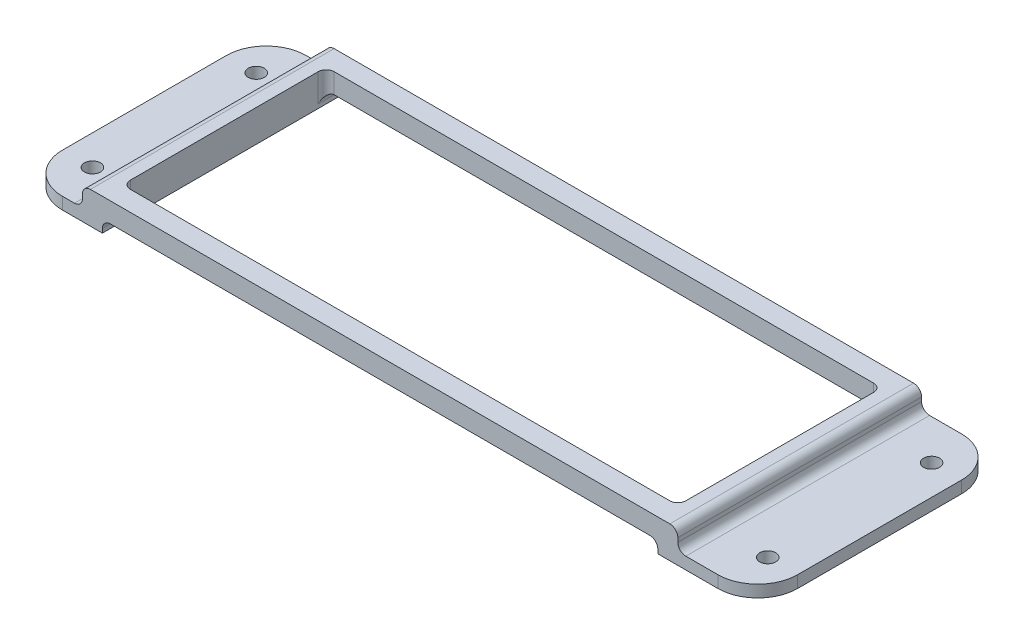
ISO-10303-21;
HEADER;
FILE_DESCRIPTION(('STEP AP214'),'2;1');
FILE_NAME('part.step','',(''),(''),'','','');
FILE_SCHEMA(('AUTOMOTIVE_DESIGN { 1 0 10303 214 1 1 1 1 }'));
ENDSEC;
DATA;
#1=APPLICATION_CONTEXT('core data for automotive mechanical design processes');
#2=APPLICATION_PROTOCOL_DEFINITION('international standard','automotive_design',2000,#1);
#3=PRODUCT_CONTEXT('',#1,'mechanical');
#4=PRODUCT('Part','Part','',(#3));
#5=PRODUCT_RELATED_PRODUCT_CATEGORY('part','',(#4));
#6=PRODUCT_DEFINITION_FORMATION('','',#4);
#7=PRODUCT_DEFINITION_CONTEXT('part definition',#1,'design');
#8=PRODUCT_DEFINITION('design','',#6,#7);
#9=PRODUCT_DEFINITION_SHAPE('','',#8);
#10=(LENGTH_UNIT() NAMED_UNIT(*) SI_UNIT(.MILLI.,.METRE.));
#11=(NAMED_UNIT(*) PLANE_ANGLE_UNIT() SI_UNIT($,.RADIAN.));
#12=(NAMED_UNIT(*) SI_UNIT($,.STERADIAN.) SOLID_ANGLE_UNIT());
#13=UNCERTAINTY_MEASURE_WITH_UNIT(LENGTH_MEASURE(1.E-05),#10,'distance_accuracy_value','');
#14=(GEOMETRIC_REPRESENTATION_CONTEXT(3) GLOBAL_UNCERTAINTY_ASSIGNED_CONTEXT((#13)) GLOBAL_UNIT_ASSIGNED_CONTEXT((#10,
#11,#12)) REPRESENTATION_CONTEXT('',''));
#15=CARTESIAN_POINT('',(0.,0.,0.));
#16=DIRECTION('',(0.,0.,1.));
#17=DIRECTION('',(1.,0.,0.));
#18=AXIS2_PLACEMENT_3D('',#15,#16,#17);
#19=CARTESIAN_POINT('',(20.,3.,-61.));
#20=DIRECTION('',(-1.,0.,0.));
#21=DIRECTION('',(0.,0.,1.));
#22=AXIS2_PLACEMENT_3D('',#19,#20,#21);
#23=PLANE('',#22);
#24=DIRECTION('',(0.,-1.,0.));
#25=VECTOR('',#24,1.);
#26=CARTESIAN_POINT('',(20.,3.,-61.));
#27=LINE('',#26,#25);
#28=CARTESIAN_POINT('',(20.,1.,-61.));
#29=VERTEX_POINT('',#28);
#30=CARTESIAN_POINT('',(20.,0.,-61.));
#31=VERTEX_POINT('',#30);
#32=EDGE_CURVE('E369',#29,#31,#27,.T.);
#33=ORIENTED_EDGE('',*,*,#32,.F.);
#34=DIRECTION('',(0.,0.,-1.));
#35=VECTOR('',#34,1.);
#36=CARTESIAN_POINT('',(20.,1.,-56.));
#37=LINE('',#36,#35);
#38=CARTESIAN_POINT('',(20.,1.,-54.));
#39=VERTEX_POINT('',#38);
#40=EDGE_CURVE('E491',#29,#39,#37,.F.);
#41=ORIENTED_EDGE('',*,*,#40,.T.);
#42=DIRECTION('',(0.,-1.,0.));
#43=VECTOR('',#42,1.);
#44=CARTESIAN_POINT('',(20.,8.,-54.));
#45=LINE('',#44,#43);
#46=CARTESIAN_POINT('',(20.,8.,-54.));
#47=VERTEX_POINT('',#46);
#48=EDGE_CURVE('E488',#39,#47,#45,.F.);
#49=ORIENTED_EDGE('',*,*,#48,.T.);
#50=DIRECTION('',(0.,0.,-1.));
#51=VECTOR('',#50,1.);
#52=CARTESIAN_POINT('',(20.,8.,-61.));
#53=LINE('',#52,#51);
#54=CARTESIAN_POINT('',(20.,8.,-7.00000000000001));
#55=VERTEX_POINT('',#54);
#56=EDGE_CURVE('E320',#55,#47,#53,.T.);
#57=ORIENTED_EDGE('',*,*,#56,.F.);
#58=DIRECTION('',(0.,1.,0.));
#59=VECTOR('',#58,1.);
#60=CARTESIAN_POINT('',(20.,3.,-7.));
#61=LINE('',#60,#59);
#62=CARTESIAN_POINT('',(20.,1.,-7.));
#63=VERTEX_POINT('',#62);
#64=EDGE_CURVE('E485',#55,#63,#61,.F.);
#65=ORIENTED_EDGE('',*,*,#64,.T.);
#66=DIRECTION('',(0.,0.,-1.));
#67=VECTOR('',#66,1.);
#68=CARTESIAN_POINT('',(20.,1.,0.));
#69=LINE('',#68,#67);
#70=CARTESIAN_POINT('',(20.,1.,0.));
#71=VERTEX_POINT('',#70);
#72=EDGE_CURVE('E482',#63,#71,#69,.F.);
#73=ORIENTED_EDGE('',*,*,#72,.T.);
#74=DIRECTION('',(0.,-1.,0.));
#75=VECTOR('',#74,1.);
#76=CARTESIAN_POINT('',(20.,3.,0.));
#77=LINE('',#76,#75);
#78=CARTESIAN_POINT('',(20.,0.,0.));
#79=VERTEX_POINT('',#78);
#80=EDGE_CURVE('E386',#71,#79,#77,.T.);
#81=ORIENTED_EDGE('',*,*,#80,.T.);
#82=DIRECTION('',(0.,0.,-1.));
#83=VECTOR('',#82,1.);
#84=CARTESIAN_POINT('',(20.,0.,-61.));
#85=LINE('',#84,#83);
#86=EDGE_CURVE('E373',#79,#31,#85,.T.);
#87=ORIENTED_EDGE('',*,*,#86,.T.);
#88=EDGE_LOOP('',(#33,#41,#49,#57,#65,#73,#81,#87));
#89=FACE_BOUND('',#88,.T.);
#90=ADVANCED_FACE('F43',(#89),#23,.F.);
#91=CARTESIAN_POINT('',(159.,3.,0.));
#92=DIRECTION('',(1.,0.,0.));
#93=DIRECTION('',(0.,0.,-1.));
#94=AXIS2_PLACEMENT_3D('',#91,#92,#93);
#95=PLANE('',#94);
#96=DIRECTION('',(0.,0.,-1.));
#97=VECTOR('',#96,1.);
#98=CARTESIAN_POINT('',(159.,1.,-5.));
#99=LINE('',#98,#97);
#100=CARTESIAN_POINT('',(159.,1.,0.));
#101=VERTEX_POINT('',#100);
#102=CARTESIAN_POINT('',(159.,1.,-7.));
#103=VERTEX_POINT('',#102);
#104=EDGE_CURVE('E61',#101,#103,#99,.T.);
#105=ORIENTED_EDGE('',*,*,#104,.T.);
#106=DIRECTION('',(0.,1.,0.));
#107=VECTOR('',#106,1.);
#108=CARTESIAN_POINT('',(159.,8.,-7.));
#109=LINE('',#108,#107);
#110=CARTESIAN_POINT('',(159.,8.,-7.00000000000001));
#111=VERTEX_POINT('',#110);
#112=EDGE_CURVE('E522',#103,#111,#109,.T.);
#113=ORIENTED_EDGE('',*,*,#112,.T.);
#114=DIRECTION('',(0.,0.,1.));
#115=VECTOR('',#114,1.);
#116=CARTESIAN_POINT('',(159.,8.,-61.));
#117=LINE('',#116,#115);
#118=CARTESIAN_POINT('',(159.,8.,-54.));
#119=VERTEX_POINT('',#118);
#120=EDGE_CURVE('E600',#119,#111,#117,.T.);
#121=ORIENTED_EDGE('',*,*,#120,.F.);
#122=DIRECTION('',(0.,-1.,0.));
#123=VECTOR('',#122,1.);
#124=CARTESIAN_POINT('',(159.,3.,-54.));
#125=LINE('',#124,#123);
#126=CARTESIAN_POINT('',(159.,1.,-54.));
#127=VERTEX_POINT('',#126);
#128=EDGE_CURVE('E516',#119,#127,#125,.T.);
#129=ORIENTED_EDGE('',*,*,#128,.T.);
#130=DIRECTION('',(0.,0.,-1.));
#131=VECTOR('',#130,1.);
#132=CARTESIAN_POINT('',(159.,1.,-61.));
#133=LINE('',#132,#131);
#134=CARTESIAN_POINT('',(159.,1.,-61.));
#135=VERTEX_POINT('',#134);
#136=EDGE_CURVE('E513',#127,#135,#133,.T.);
#137=ORIENTED_EDGE('',*,*,#136,.T.);
#138=DIRECTION('',(0.,-1.,0.));
#139=VECTOR('',#138,1.);
#140=CARTESIAN_POINT('',(159.,3.,-61.));
#141=LINE('',#140,#139);
#142=CARTESIAN_POINT('',(159.,0.,-61.));
#143=VERTEX_POINT('',#142);
#144=EDGE_CURVE('E258',#135,#143,#141,.T.);
#145=ORIENTED_EDGE('',*,*,#144,.T.);
#146=DIRECTION('',(0.,0.,1.));
#147=VECTOR('',#146,1.);
#148=CARTESIAN_POINT('',(159.,0.,0.));
#149=LINE('',#148,#147);
#150=CARTESIAN_POINT('',(159.,0.,0.));
#151=VERTEX_POINT('',#150);
#152=EDGE_CURVE('E261',#143,#151,#149,.T.);
#153=ORIENTED_EDGE('',*,*,#152,.T.);
#154=DIRECTION('',(0.,-1.,0.));
#155=VECTOR('',#154,1.);
#156=CARTESIAN_POINT('',(159.,3.,0.));
#157=LINE('',#156,#155);
#158=EDGE_CURVE('E245',#101,#151,#157,.T.);
#159=ORIENTED_EDGE('',*,*,#158,.F.);
#160=EDGE_LOOP('',(#105,#113,#121,#129,#137,#145,#153,#159));
#161=FACE_BOUND('',#160,.T.);
#162=ADVANCED_FACE('F262',(#161),#95,.F.);
#163=CARTESIAN_POINT('',(0.,3.,0.));
#164=DIRECTION('',(0.,1.,0.));
#165=DIRECTION('',(0.,0.,1.));
#166=AXIS2_PLACEMENT_3D('',#163,#164,#165);
#167=PLANE('',#166);
#168=DIRECTION('',(1.,0.,0.));
#169=VECTOR('',#168,1.);
#170=CARTESIAN_POINT('',(20.,3.,0.));
#171=LINE('',#170,#169);
#172=CARTESIAN_POINT('',(10.,3.,0.));
#173=VERTEX_POINT('',#172);
#174=CARTESIAN_POINT('',(13.,3.,0.));
#175=VERTEX_POINT('',#174);
#176=EDGE_CURVE('E357',#173,#175,#171,.T.);
#177=ORIENTED_EDGE('',*,*,#176,.T.);
#178=DIRECTION('',(0.,0.,1.));
#179=VECTOR('',#178,1.);
#180=CARTESIAN_POINT('',(13.,3.,0.));
#181=LINE('',#180,#179);
#182=CARTESIAN_POINT('',(13.,3.,-61.));
#183=VERTEX_POINT('',#182);
#184=EDGE_CURVE('E525',#175,#183,#181,.F.);
#185=ORIENTED_EDGE('',*,*,#184,.T.);
#186=DIRECTION('',(-1.,0.,0.));
#187=VECTOR('',#186,1.);
#188=CARTESIAN_POINT('',(0.,3.,-61.));
#189=LINE('',#188,#187);
#190=CARTESIAN_POINT('',(10.,3.,-61.));
#191=VERTEX_POINT('',#190);
#192=EDGE_CURVE('E361',#183,#191,#189,.T.);
#193=ORIENTED_EDGE('',*,*,#192,.T.);
#194=CARTESIAN_POINT('',(10.,3.,-51.));
#195=DIRECTION('',(0.,1.,0.));
#196=DIRECTION('',(0.,0.,1.));
#197=AXIS2_PLACEMENT_3D('',#194,#195,#196);
#198=CIRCLE('',#197,10.);
#199=CARTESIAN_POINT('',(0.,3.,-51.));
#200=VERTEX_POINT('',#199);
#201=EDGE_CURVE('E438',#191,#200,#198,.T.);
#202=ORIENTED_EDGE('',*,*,#201,.T.);
#203=DIRECTION('',(0.,0.,1.));
#204=VECTOR('',#203,1.);
#205=CARTESIAN_POINT('',(0.,3.,-61.));
#206=LINE('',#205,#204);
#207=CARTESIAN_POINT('',(0.,3.,-10.));
#208=VERTEX_POINT('',#207);
#209=EDGE_CURVE('E365',#200,#208,#206,.T.);
#210=ORIENTED_EDGE('',*,*,#209,.T.);
#211=CARTESIAN_POINT('',(10.,3.,-10.));
#212=DIRECTION('',(0.,1.,0.));
#213=DIRECTION('',(0.,0.,1.));
#214=AXIS2_PLACEMENT_3D('',#211,#212,#213);
#215=CIRCLE('',#214,10.);
#216=EDGE_CURVE('E435',#208,#173,#215,.T.);
#217=ORIENTED_EDGE('',*,*,#216,.T.);
#218=EDGE_LOOP('',(#177,#185,#193,#202,#210,#217));
#219=FACE_BOUND('',#218,.T.);
#220=CARTESIAN_POINT('',(7.49999999999999,3.,-10.));
#221=DIRECTION('',(0.,1.,0.));
#222=DIRECTION('',(0.,0.,1.));
#223=AXIS2_PLACEMENT_3D('',#220,#221,#222);
#224=CIRCLE('',#223,2.);
#225=CARTESIAN_POINT('',(7.49999999999999,3.,-8.00000000000001));
#226=VERTEX_POINT('',#225);
#227=EDGE_CURVE('E349',#226,#226,#224,.T.);
#228=ORIENTED_EDGE('',*,*,#227,.F.);
#229=EDGE_LOOP('',(#228));
#230=FACE_BOUND('',#229,.T.);
#231=CARTESIAN_POINT('',(7.49999999999996,3.,-51.));
#232=DIRECTION('',(0.,1.,0.));
#233=DIRECTION('',(0.,0.,-1.));
#234=AXIS2_PLACEMENT_3D('',#231,#232,#233);
#235=CIRCLE('',#234,2.);
#236=CARTESIAN_POINT('',(7.49999999999996,3.,-53.));
#237=VERTEX_POINT('',#236);
#238=EDGE_CURVE('E341',#237,#237,#235,.T.);
#239=ORIENTED_EDGE('',*,*,#238,.F.);
#240=EDGE_LOOP('',(#239));
#241=FACE_BOUND('',#240,.T.);
#242=ADVANCED_FACE('F678',(#219,#230,#241),#167,.T.);
#243=CARTESIAN_POINT('',(0.,0.,0.));
#244=DIRECTION('',(0.,1.,0.));
#245=DIRECTION('',(0.,0.,1.));
#246=AXIS2_PLACEMENT_3D('',#243,#244,#245);
#247=PLANE('',#246);
#248=DIRECTION('',(0.,0.,1.));
#249=VECTOR('',#248,1.);
#250=CARTESIAN_POINT('',(0.,0.,-61.));
#251=LINE('',#250,#249);
#252=CARTESIAN_POINT('',(0.,0.,-51.));
#253=VERTEX_POINT('',#252);
#254=CARTESIAN_POINT('',(0.,0.,-10.));
#255=VERTEX_POINT('',#254);
#256=EDGE_CURVE('E362',#253,#255,#251,.T.);
#257=ORIENTED_EDGE('',*,*,#256,.F.);
#258=CARTESIAN_POINT('',(10.,0.,-51.));
#259=DIRECTION('',(0.,1.,0.));
#260=DIRECTION('',(0.,0.,1.));
#261=AXIS2_PLACEMENT_3D('',#258,#259,#260);
#262=CIRCLE('',#261,10.);
#263=CARTESIAN_POINT('',(10.,0.,-61.));
#264=VERTEX_POINT('',#263);
#265=EDGE_CURVE('E432',#253,#264,#262,.F.);
#266=ORIENTED_EDGE('',*,*,#265,.T.);
#267=DIRECTION('',(-1.,0.,0.));
#268=VECTOR('',#267,1.);
#269=CARTESIAN_POINT('',(0.,0.,-61.));
#270=LINE('',#269,#268);
#271=EDGE_CURVE('E377',#31,#264,#270,.T.);
#272=ORIENTED_EDGE('',*,*,#271,.F.);
#273=ORIENTED_EDGE('',*,*,#86,.F.);
#274=DIRECTION('',(1.,0.,0.));
#275=VECTOR('',#274,1.);
#276=CARTESIAN_POINT('',(20.,0.,0.));
#277=LINE('',#276,#275);
#278=CARTESIAN_POINT('',(10.,0.,0.));
#279=VERTEX_POINT('',#278);
#280=EDGE_CURVE('E353',#279,#79,#277,.T.);
#281=ORIENTED_EDGE('',*,*,#280,.F.);
#282=CARTESIAN_POINT('',(10.,0.,-10.));
#283=DIRECTION('',(0.,1.,0.));
#284=DIRECTION('',(0.,0.,1.));
#285=AXIS2_PLACEMENT_3D('',#282,#283,#284);
#286=CIRCLE('',#285,10.);
#287=EDGE_CURVE('E429',#279,#255,#286,.F.);
#288=ORIENTED_EDGE('',*,*,#287,.T.);
#289=EDGE_LOOP('',(#257,#266,#272,#273,#281,#288));
#290=FACE_BOUND('',#289,.T.);
#291=CARTESIAN_POINT('',(7.49999999999999,0.,-10.));
#292=DIRECTION('',(0.,1.,0.));
#293=DIRECTION('',(0.,0.,1.));
#294=AXIS2_PLACEMENT_3D('',#291,#292,#293);
#295=CIRCLE('',#294,2.);
#296=CARTESIAN_POINT('',(7.49999999999999,0.,-8.00000000000001));
#297=VERTEX_POINT('',#296);
#298=EDGE_CURVE('E345',#297,#297,#295,.T.);
#299=ORIENTED_EDGE('',*,*,#298,.T.);
#300=EDGE_LOOP('',(#299));
#301=FACE_BOUND('',#300,.T.);
#302=CARTESIAN_POINT('',(7.49999999999996,0.,-51.));
#303=DIRECTION('',(0.,1.,0.));
#304=DIRECTION('',(0.,0.,-1.));
#305=AXIS2_PLACEMENT_3D('',#302,#303,#304);
#306=CIRCLE('',#305,2.);
#307=CARTESIAN_POINT('',(7.49999999999996,0.,-53.));
#308=VERTEX_POINT('',#307);
#309=EDGE_CURVE('E340',#308,#308,#306,.T.);
#310=ORIENTED_EDGE('',*,*,#309,.T.);
#311=EDGE_LOOP('',(#310));
#312=FACE_BOUND('',#311,.T.);
#313=ADVANCED_FACE('F690',(#290,#301,#312),#247,.F.);
#314=CARTESIAN_POINT('',(20.,3.,0.));
#315=DIRECTION('',(0.,0.,-1.));
#316=DIRECTION('',(-1.,0.,0.));
#317=AXIS2_PLACEMENT_3D('',#314,#315,#316);
#318=PLANE('',#317);
#319=DIRECTION('',(0.,-1.,0.));
#320=VECTOR('',#319,1.);
#321=CARTESIAN_POINT('',(164.,8.,0.));
#322=LINE('',#321,#320);
#323=CARTESIAN_POINT('',(164.,6.,0.));
#324=VERTEX_POINT('',#323);
#325=CARTESIAN_POINT('',(164.,5.,0.));
#326=VERTEX_POINT('',#325);
#327=EDGE_CURVE('E618',#324,#326,#322,.T.);
#328=ORIENTED_EDGE('',*,*,#327,.F.);
#329=CARTESIAN_POINT('',(162.,6.,0.));
#330=DIRECTION('',(0.,0.,-1.));
#331=DIRECTION('',(-1.,0.,0.));
#332=AXIS2_PLACEMENT_3D('',#329,#330,#331);
#333=CIRCLE('',#332,2.);
#334=CARTESIAN_POINT('',(162.,8.,0.));
#335=VERTEX_POINT('',#334);
#336=EDGE_CURVE('E465',#324,#335,#333,.F.);
#337=ORIENTED_EDGE('',*,*,#336,.T.);
#338=DIRECTION('',(1.,0.,0.));
#339=VECTOR('',#338,1.);
#340=CARTESIAN_POINT('',(20.,8.,0.));
#341=LINE('',#340,#339);
#342=CARTESIAN_POINT('',(17.,8.,0.));
#343=VERTEX_POINT('',#342);
#344=EDGE_CURVE('E328',#343,#335,#341,.T.);
#345=ORIENTED_EDGE('',*,*,#344,.F.);
#346=CARTESIAN_POINT('',(17.,6.,0.));
#347=DIRECTION('',(0.,0.,-1.));
#348=DIRECTION('',(-1.,0.,0.));
#349=AXIS2_PLACEMENT_3D('',#346,#347,#348);
#350=CIRCLE('',#349,2.);
#351=CARTESIAN_POINT('',(15.,6.,0.));
#352=VERTEX_POINT('',#351);
#353=EDGE_CURVE('E462',#343,#352,#350,.F.);
#354=ORIENTED_EDGE('',*,*,#353,.T.);
#355=DIRECTION('',(0.,-1.,0.));
#356=VECTOR('',#355,1.);
#357=CARTESIAN_POINT('',(15.,8.,0.));
#358=LINE('',#357,#356);
#359=CARTESIAN_POINT('',(15.,5.,0.));
#360=VERTEX_POINT('',#359);
#361=EDGE_CURVE('E332',#352,#360,#358,.T.);
#362=ORIENTED_EDGE('',*,*,#361,.T.);
#363=CARTESIAN_POINT('',(13.,5.,0.));
#364=DIRECTION('',(0.,0.,-1.));
#365=DIRECTION('',(-1.,0.,0.));
#366=AXIS2_PLACEMENT_3D('',#363,#364,#365);
#367=CIRCLE('',#366,2.);
#368=EDGE_CURVE('E554',#360,#175,#367,.T.);
#369=ORIENTED_EDGE('',*,*,#368,.T.);
#370=ORIENTED_EDGE('',*,*,#176,.F.);
#371=DIRECTION('',(0.,-1.,0.));
#372=VECTOR('',#371,1.);
#373=CARTESIAN_POINT('',(10.,3.,0.));
#374=LINE('',#373,#372);
#375=EDGE_CURVE('E401',#173,#279,#374,.T.);
#376=ORIENTED_EDGE('',*,*,#375,.T.);
#377=ORIENTED_EDGE('',*,*,#280,.T.);
#378=ORIENTED_EDGE('',*,*,#80,.F.);
#379=CARTESIAN_POINT('',(22.,1.,0.));
#380=DIRECTION('',(0.,0.,-1.));
#381=DIRECTION('',(-1.,0.,0.));
#382=AXIS2_PLACEMENT_3D('',#379,#380,#381);
#383=CIRCLE('',#382,2.);
#384=CARTESIAN_POINT('',(22.,3.,0.));
#385=VERTEX_POINT('',#384);
#386=EDGE_CURVE('E540',#71,#385,#383,.T.);
#387=ORIENTED_EDGE('',*,*,#386,.T.);
#388=DIRECTION('',(-1.,0.,0.));
#389=VECTOR('',#388,1.);
#390=CARTESIAN_POINT('',(166.071067811865,3.,0.));
#391=LINE('',#390,#389);
#392=CARTESIAN_POINT('',(157.,3.,0.));
#393=VERTEX_POINT('',#392);
#394=EDGE_CURVE('E305',#393,#385,#391,.T.);
#395=ORIENTED_EDGE('',*,*,#394,.F.);
#396=CARTESIAN_POINT('',(157.,1.,0.));
#397=DIRECTION('',(0.,0.,-1.));
#398=DIRECTION('',(-1.,0.,0.));
#399=AXIS2_PLACEMENT_3D('',#396,#397,#398);
#400=CIRCLE('',#399,2.);
#401=EDGE_CURVE('E255',#393,#101,#400,.T.);
#402=ORIENTED_EDGE('',*,*,#401,.T.);
#403=ORIENTED_EDGE('',*,*,#158,.T.);
#404=DIRECTION('',(1.,0.,0.));
#405=VECTOR('',#404,1.);
#406=CARTESIAN_POINT('',(184.,0.,0.));
#407=LINE('',#406,#405);
#408=CARTESIAN_POINT('',(174.,0.,0.));
#409=VERTEX_POINT('',#408);
#410=EDGE_CURVE('E251',#151,#409,#407,.T.);
#411=ORIENTED_EDGE('',*,*,#410,.T.);
#412=DIRECTION('',(0.,-1.,0.));
#413=VECTOR('',#412,1.);
#414=CARTESIAN_POINT('',(174.,3.,0.));
#415=LINE('',#414,#413);
#416=CARTESIAN_POINT('',(174.,3.,0.));
#417=VERTEX_POINT('',#416);
#418=EDGE_CURVE('E405',#409,#417,#415,.F.);
#419=ORIENTED_EDGE('',*,*,#418,.T.);
#420=DIRECTION('',(1.,0.,0.));
#421=VECTOR('',#420,1.);
#422=CARTESIAN_POINT('',(184.,3.,0.));
#423=LINE('',#422,#421);
#424=CARTESIAN_POINT('',(166.,3.,0.));
#425=VERTEX_POINT('',#424);
#426=EDGE_CURVE('E269',#425,#417,#423,.T.);
#427=ORIENTED_EDGE('',*,*,#426,.F.);
#428=CARTESIAN_POINT('',(166.,5.,0.));
#429=DIRECTION('',(0.,0.,-1.));
#430=DIRECTION('',(-1.,0.,0.));
#431=AXIS2_PLACEMENT_3D('',#428,#429,#430);
#432=CIRCLE('',#431,2.);
#433=EDGE_CURVE('E11',#425,#326,#432,.T.);
#434=ORIENTED_EDGE('',*,*,#433,.T.);
#435=EDGE_LOOP('',(#328,#337,#345,#354,#362,#369,#370,#376,#377,#378,#387,#395,#402,#403,#411,
#419,#427,#434));
#436=FACE_BOUND('',#435,.T.);
#437=ADVANCED_FACE('F248',(#436),#318,.F.);
#438=CARTESIAN_POINT('',(0.,3.,-61.));
#439=DIRECTION('',(0.,0.,1.));
#440=DIRECTION('',(1.,0.,0.));
#441=AXIS2_PLACEMENT_3D('',#438,#439,#440);
#442=PLANE('',#441);
#443=DIRECTION('',(-1.,0.,0.));
#444=VECTOR('',#443,1.);
#445=CARTESIAN_POINT('',(20.,8.,-61.));
#446=LINE('',#445,#444);
#447=CARTESIAN_POINT('',(162.,8.,-61.));
#448=VERTEX_POINT('',#447);
#449=CARTESIAN_POINT('',(17.,8.,-61.));
#450=VERTEX_POINT('',#449);
#451=EDGE_CURVE('E324',#448,#450,#446,.T.);
#452=ORIENTED_EDGE('',*,*,#451,.F.);
#453=CARTESIAN_POINT('',(162.,6.,-60.9999999999998));
#454=DIRECTION('',(0.,0.,1.));
#455=DIRECTION('',(1.,0.,0.));
#456=AXIS2_PLACEMENT_3D('',#453,#454,#455);
#457=CIRCLE('',#456,2.);
#458=CARTESIAN_POINT('',(164.,6.,-61.));
#459=VERTEX_POINT('',#458);
#460=EDGE_CURVE('E452',#448,#459,#457,.F.);
#461=ORIENTED_EDGE('',*,*,#460,.T.);
#462=DIRECTION('',(0.,-1.,0.));
#463=VECTOR('',#462,1.);
#464=CARTESIAN_POINT('',(164.,8.,-61.));
#465=LINE('',#464,#463);
#466=CARTESIAN_POINT('',(164.,5.,-61.));
#467=VERTEX_POINT('',#466);
#468=EDGE_CURVE('E602',#459,#467,#465,.T.);
#469=ORIENTED_EDGE('',*,*,#468,.T.);
#470=CARTESIAN_POINT('',(166.,5.,-60.9999999999998));
#471=DIRECTION('',(0.,0.,1.));
#472=DIRECTION('',(1.,0.,0.));
#473=AXIS2_PLACEMENT_3D('',#470,#471,#472);
#474=CIRCLE('',#473,2.);
#475=CARTESIAN_POINT('',(166.,3.,-61.));
#476=VERTEX_POINT('',#475);
#477=EDGE_CURVE('E53',#467,#476,#474,.T.);
#478=ORIENTED_EDGE('',*,*,#477,.T.);
#479=DIRECTION('',(-1.,0.,0.));
#480=VECTOR('',#479,1.);
#481=CARTESIAN_POINT('',(159.,3.,-61.));
#482=LINE('',#481,#480);
#483=CARTESIAN_POINT('',(174.,3.,-61.));
#484=VERTEX_POINT('',#483);
#485=EDGE_CURVE('E257',#484,#476,#482,.T.);
#486=ORIENTED_EDGE('',*,*,#485,.F.);
#487=DIRECTION('',(0.,-1.,0.));
#488=VECTOR('',#487,1.);
#489=CARTESIAN_POINT('',(174.,3.,-60.9999999999998));
#490=LINE('',#489,#488);
#491=CARTESIAN_POINT('',(174.,0.,-61.));
#492=VERTEX_POINT('',#491);
#493=EDGE_CURVE('E418',#484,#492,#490,.T.);
#494=ORIENTED_EDGE('',*,*,#493,.T.);
#495=DIRECTION('',(-1.,0.,0.));
#496=VECTOR('',#495,1.);
#497=CARTESIAN_POINT('',(159.,0.,-61.));
#498=LINE('',#497,#496);
#499=EDGE_CURVE('E268',#492,#143,#498,.T.);
#500=ORIENTED_EDGE('',*,*,#499,.T.);
#501=ORIENTED_EDGE('',*,*,#144,.F.);
#502=CARTESIAN_POINT('',(157.,1.,-60.9999999999998));
#503=DIRECTION('',(0.,0.,1.));
#504=DIRECTION('',(1.,0.,0.));
#505=AXIS2_PLACEMENT_3D('',#502,#503,#504);
#506=CIRCLE('',#505,2.);
#507=CARTESIAN_POINT('',(157.,3.,-61.));
#508=VERTEX_POINT('',#507);
#509=EDGE_CURVE('E551',#135,#508,#506,.T.);
#510=ORIENTED_EDGE('',*,*,#509,.T.);
#511=DIRECTION('',(-1.,0.,0.));
#512=VECTOR('',#511,1.);
#513=CARTESIAN_POINT('',(166.071067811865,3.,-61.));
#514=LINE('',#513,#512);
#515=CARTESIAN_POINT('',(22.,3.,-61.));
#516=VERTEX_POINT('',#515);
#517=EDGE_CURVE('E613',#508,#516,#514,.T.);
#518=ORIENTED_EDGE('',*,*,#517,.T.);
#519=CARTESIAN_POINT('',(22.,1.,-61.));
#520=DIRECTION('',(0.,0.,1.));
#521=DIRECTION('',(1.,0.,0.));
#522=AXIS2_PLACEMENT_3D('',#519,#520,#521);
#523=CIRCLE('',#522,2.);
#524=EDGE_CURVE('E531',#516,#29,#523,.T.);
#525=ORIENTED_EDGE('',*,*,#524,.T.);
#526=ORIENTED_EDGE('',*,*,#32,.T.);
#527=ORIENTED_EDGE('',*,*,#271,.T.);
#528=DIRECTION('',(0.,-1.,0.));
#529=VECTOR('',#528,1.);
#530=CARTESIAN_POINT('',(10.,3.,-61.));
#531=LINE('',#530,#529);
#532=EDGE_CURVE('E414',#264,#191,#531,.F.);
#533=ORIENTED_EDGE('',*,*,#532,.T.);
#534=ORIENTED_EDGE('',*,*,#192,.F.);
#535=CARTESIAN_POINT('',(13.,5.,-61.));
#536=DIRECTION('',(0.,0.,1.));
#537=DIRECTION('',(1.,0.,0.));
#538=AXIS2_PLACEMENT_3D('',#535,#536,#537);
#539=CIRCLE('',#538,2.);
#540=CARTESIAN_POINT('',(15.,5.,-61.));
#541=VERTEX_POINT('',#540);
#542=EDGE_CURVE('E557',#183,#541,#539,.T.);
#543=ORIENTED_EDGE('',*,*,#542,.T.);
#544=DIRECTION('',(0.,-1.,0.));
#545=VECTOR('',#544,1.);
#546=CARTESIAN_POINT('',(15.,8.,-61.));
#547=LINE('',#546,#545);
#548=CARTESIAN_POINT('',(15.,6.,-61.));
#549=VERTEX_POINT('',#548);
#550=EDGE_CURVE('E336',#549,#541,#547,.T.);
#551=ORIENTED_EDGE('',*,*,#550,.F.);
#552=CARTESIAN_POINT('',(17.,6.,-61.));
#553=DIRECTION('',(0.,0.,1.));
#554=DIRECTION('',(1.,0.,0.));
#555=AXIS2_PLACEMENT_3D('',#552,#553,#554);
#556=CIRCLE('',#555,2.);
#557=EDGE_CURVE('E449',#549,#450,#556,.F.);
#558=ORIENTED_EDGE('',*,*,#557,.T.);
#559=EDGE_LOOP('',(#452,#461,#469,#478,#486,#494,#500,#501,#510,#518,#525,#526,#527,#533,#534,
#543,#551,#558));
#560=FACE_BOUND('',#559,.T.);
#561=ADVANCED_FACE('F633',(#560),#442,.F.);
#562=CARTESIAN_POINT('',(0.,3.,-61.));
#563=DIRECTION('',(1.,0.,0.));
#564=DIRECTION('',(0.,0.,-1.));
#565=AXIS2_PLACEMENT_3D('',#562,#563,#564);
#566=PLANE('',#565);
#567=ORIENTED_EDGE('',*,*,#209,.F.);
#568=DIRECTION('',(0.,-1.,0.));
#569=VECTOR('',#568,1.);
#570=CARTESIAN_POINT('',(0.,3.,-51.));
#571=LINE('',#570,#569);
#572=EDGE_CURVE('E425',#200,#253,#571,.T.);
#573=ORIENTED_EDGE('',*,*,#572,.T.);
#574=ORIENTED_EDGE('',*,*,#256,.T.);
#575=DIRECTION('',(0.,-1.,0.));
#576=VECTOR('',#575,1.);
#577=CARTESIAN_POINT('',(0.,3.,-10.));
#578=LINE('',#577,#576);
#579=EDGE_CURVE('E422',#255,#208,#578,.F.);
#580=ORIENTED_EDGE('',*,*,#579,.T.);
#581=EDGE_LOOP('',(#567,#573,#574,#580));
#582=FACE_BOUND('',#581,.T.);
#583=ADVANCED_FACE('F758',(#582),#566,.F.);
#584=CARTESIAN_POINT('',(7.49999999999999,3.,-10.));
#585=DIRECTION('',(0.,-1.,0.));
#586=DIRECTION('',(0.,0.,-1.));
#587=AXIS2_PLACEMENT_3D('',#584,#585,#586);
#588=CYLINDRICAL_SURFACE('',#587,2.);
#589=ORIENTED_EDGE('',*,*,#227,.T.);
#590=EDGE_LOOP('',(#589));
#591=FACE_BOUND('',#590,.T.);
#592=ORIENTED_EDGE('',*,*,#298,.F.);
#593=EDGE_LOOP('',(#592));
#594=FACE_BOUND('',#593,.T.);
#595=ADVANCED_FACE('F760',(#591,#594),#588,.F.);
#596=CARTESIAN_POINT('',(7.49999999999996,3.,-51.));
#597=DIRECTION('',(0.,-1.,0.));
#598=DIRECTION('',(0.,0.,-1.));
#599=AXIS2_PLACEMENT_3D('',#596,#597,#598);
#600=CYLINDRICAL_SURFACE('',#599,2.);
#601=ORIENTED_EDGE('',*,*,#238,.T.);
#602=EDGE_LOOP('',(#601));
#603=FACE_BOUND('',#602,.T.);
#604=ORIENTED_EDGE('',*,*,#309,.F.);
#605=EDGE_LOOP('',(#604));
#606=FACE_BOUND('',#605,.T.);
#607=ADVANCED_FACE('F765',(#603,#606),#600,.F.);
#608=CARTESIAN_POINT('',(15.,8.,-61.));
#609=DIRECTION('',(1.,0.,0.));
#610=DIRECTION('',(0.,0.,-1.));
#611=AXIS2_PLACEMENT_3D('',#608,#609,#610);
#612=PLANE('',#611);
#613=ORIENTED_EDGE('',*,*,#361,.F.);
#614=DIRECTION('',(0.,0.,1.));
#615=VECTOR('',#614,1.);
#616=CARTESIAN_POINT('',(15.,6.,-61.));
#617=LINE('',#616,#615);
#618=EDGE_CURVE('E472',#352,#549,#617,.F.);
#619=ORIENTED_EDGE('',*,*,#618,.T.);
#620=ORIENTED_EDGE('',*,*,#550,.T.);
#621=DIRECTION('',(0.,0.,1.));
#622=VECTOR('',#621,1.);
#623=CARTESIAN_POINT('',(15.,5.,-61.));
#624=LINE('',#623,#622);
#625=EDGE_CURVE('E468',#541,#360,#624,.T.);
#626=ORIENTED_EDGE('',*,*,#625,.T.);
#627=EDGE_LOOP('',(#613,#619,#620,#626));
#628=FACE_BOUND('',#627,.T.);
#629=ADVANCED_FACE('F669',(#628),#612,.F.);
#630=CARTESIAN_POINT('',(0.,8.,0.));
#631=DIRECTION('',(0.,-1.,0.));
#632=DIRECTION('',(0.,0.,-1.));
#633=AXIS2_PLACEMENT_3D('',#630,#631,#632);
#634=PLANE('',#633);
#635=DIRECTION('',(-1.,0.,0.));
#636=VECTOR('',#635,1.);
#637=CARTESIAN_POINT('',(166.071067811865,8.,-5.));
#638=LINE('',#637,#636);
#639=CARTESIAN_POINT('',(157.,8.,-5.));
#640=VERTEX_POINT('',#639);
#641=CARTESIAN_POINT('',(22.,8.,-5.));
#642=VERTEX_POINT('',#641);
#643=EDGE_CURVE('E316',#640,#642,#638,.T.);
#644=ORIENTED_EDGE('',*,*,#643,.T.);
#645=CARTESIAN_POINT('',(22.,8.,-7.));
#646=DIRECTION('',(0.,-1.,0.));
#647=DIRECTION('',(0.,0.,-1.));
#648=AXIS2_PLACEMENT_3D('',#645,#646,#647);
#649=CIRCLE('',#648,2.);
#650=EDGE_CURVE('E537',#642,#55,#649,.T.);
#651=ORIENTED_EDGE('',*,*,#650,.T.);
#652=ORIENTED_EDGE('',*,*,#56,.T.);
#653=CARTESIAN_POINT('',(22.,8.,-54.));
#654=DIRECTION('',(0.,-1.,0.));
#655=DIRECTION('',(0.,0.,-1.));
#656=AXIS2_PLACEMENT_3D('',#653,#654,#655);
#657=CIRCLE('',#656,2.);
#658=CARTESIAN_POINT('',(22.,8.,-56.));
#659=VERTEX_POINT('',#658);
#660=EDGE_CURVE('E534',#47,#659,#657,.T.);
#661=ORIENTED_EDGE('',*,*,#660,.T.);
#662=DIRECTION('',(-1.,0.,0.));
#663=VECTOR('',#662,1.);
#664=CARTESIAN_POINT('',(166.071067811865,8.,-56.));
#665=LINE('',#664,#663);
#666=CARTESIAN_POINT('',(157.,8.,-56.));
#667=VERTEX_POINT('',#666);
#668=EDGE_CURVE('E608',#667,#659,#665,.T.);
#669=ORIENTED_EDGE('',*,*,#668,.F.);
#670=CARTESIAN_POINT('',(157.,8.,-54.));
#671=DIRECTION('',(0.,-1.,0.));
#672=DIRECTION('',(0.,0.,-1.));
#673=AXIS2_PLACEMENT_3D('',#670,#671,#672);
#674=CIRCLE('',#673,2.);
#675=EDGE_CURVE('E543',#667,#119,#674,.T.);
#676=ORIENTED_EDGE('',*,*,#675,.T.);
#677=ORIENTED_EDGE('',*,*,#120,.T.);
#678=CARTESIAN_POINT('',(157.,8.,-7.));
#679=DIRECTION('',(0.,-1.,0.));
#680=DIRECTION('',(0.,0.,-1.));
#681=AXIS2_PLACEMENT_3D('',#678,#679,#680);
#682=CIRCLE('',#681,2.);
#683=EDGE_CURVE('E546',#111,#640,#682,.T.);
#684=ORIENTED_EDGE('',*,*,#683,.T.);
#685=EDGE_LOOP('',(#644,#651,#652,#661,#669,#676,#677,#684));
#686=FACE_BOUND('',#685,.T.);
#687=ORIENTED_EDGE('',*,*,#344,.T.);
#688=DIRECTION('',(0.,0.,-1.));
#689=VECTOR('',#688,1.);
#690=CARTESIAN_POINT('',(162.,8.,0.));
#691=LINE('',#690,#689);
#692=EDGE_CURVE('E445',#335,#448,#691,.T.);
#693=ORIENTED_EDGE('',*,*,#692,.T.);
#694=ORIENTED_EDGE('',*,*,#451,.T.);
#695=DIRECTION('',(0.,0.,1.));
#696=VECTOR('',#695,1.);
#697=CARTESIAN_POINT('',(17.,8.,0.));
#698=LINE('',#697,#696);
#699=EDGE_CURVE('E441',#450,#343,#698,.T.);
#700=ORIENTED_EDGE('',*,*,#699,.T.);
#701=EDGE_LOOP('',(#687,#693,#694,#700));
#702=FACE_BOUND('',#701,.T.);
#703=ADVANCED_FACE('F595',(#686,#702),#634,.F.);
#704=CARTESIAN_POINT('',(166.071067811865,3.,0.));
#705=DIRECTION('',(0.,1.,0.));
#706=DIRECTION('',(0.,0.,1.));
#707=AXIS2_PLACEMENT_3D('',#704,#705,#706);
#708=PLANE('',#707);
#709=ORIENTED_EDGE('',*,*,#394,.T.);
#710=DIRECTION('',(0.,0.,-1.));
#711=VECTOR('',#710,1.);
#712=CARTESIAN_POINT('',(22.,3.,-5.));
#713=LINE('',#712,#711);
#714=CARTESIAN_POINT('',(22.,3.,-5.));
#715=VERTEX_POINT('',#714);
#716=EDGE_CURVE('E510',#385,#715,#713,.T.);
#717=ORIENTED_EDGE('',*,*,#716,.T.);
#718=DIRECTION('',(-1.,0.,0.));
#719=VECTOR('',#718,1.);
#720=CARTESIAN_POINT('',(166.071067811865,3.,-5.));
#721=LINE('',#720,#719);
#722=CARTESIAN_POINT('',(157.,3.,-5.));
#723=VERTEX_POINT('',#722);
#724=EDGE_CURVE('E312',#723,#715,#721,.T.);
#725=ORIENTED_EDGE('',*,*,#724,.F.);
#726=DIRECTION('',(0.,0.,-1.));
#727=VECTOR('',#726,1.);
#728=CARTESIAN_POINT('',(157.,3.,0.));
#729=LINE('',#728,#727);
#730=EDGE_CURVE('E507',#723,#393,#729,.F.);
#731=ORIENTED_EDGE('',*,*,#730,.T.);
#732=EDGE_LOOP('',(#709,#717,#725,#731));
#733=FACE_BOUND('',#732,.T.);
#734=ADVANCED_FACE('F582',(#733),#708,.F.);
#735=CARTESIAN_POINT('',(166.071067811865,8.,-5.));
#736=DIRECTION('',(0.,0.,1.));
#737=DIRECTION('',(0.,-1.,0.));
#738=AXIS2_PLACEMENT_3D('',#735,#736,#737);
#739=PLANE('',#738);
#740=ORIENTED_EDGE('',*,*,#724,.T.);
#741=DIRECTION('',(0.,1.,0.));
#742=VECTOR('',#741,1.);
#743=CARTESIAN_POINT('',(22.,8.,-5.));
#744=LINE('',#743,#742);
#745=EDGE_CURVE('E503',#715,#642,#744,.T.);
#746=ORIENTED_EDGE('',*,*,#745,.T.);
#747=ORIENTED_EDGE('',*,*,#643,.F.);
#748=DIRECTION('',(0.,1.,0.));
#749=VECTOR('',#748,1.);
#750=CARTESIAN_POINT('',(157.,3.,-5.));
#751=LINE('',#750,#749);
#752=EDGE_CURVE('E500',#640,#723,#751,.F.);
#753=ORIENTED_EDGE('',*,*,#752,.T.);
#754=EDGE_LOOP('',(#740,#746,#747,#753));
#755=FACE_BOUND('',#754,.T.);
#756=ADVANCED_FACE('F592',(#755),#739,.F.);
#757=CARTESIAN_POINT('',(0.,3.,0.));
#758=DIRECTION('',(0.,-1.,0.));
#759=DIRECTION('',(0.,0.,-1.));
#760=AXIS2_PLACEMENT_3D('',#757,#758,#759);
#761=PLANE('',#760);
#762=CARTESIAN_POINT('',(176.5,3.,-51.));
#763=DIRECTION('',(0.,1.,0.));
#764=DIRECTION('',(0.,0.,1.));
#765=AXIS2_PLACEMENT_3D('',#762,#763,#764);
#766=CIRCLE('',#765,2.);
#767=CARTESIAN_POINT('',(176.5,3.,-49.));
#768=VERTEX_POINT('',#767);
#769=EDGE_CURVE('E299',#768,#768,#766,.T.);
#770=ORIENTED_EDGE('',*,*,#769,.F.);
#771=EDGE_LOOP('',(#770));
#772=FACE_BOUND('',#771,.T.);
#773=CARTESIAN_POINT('',(176.5,3.,-10.));
#774=DIRECTION('',(0.,1.,0.));
#775=DIRECTION('',(0.,0.,-1.));
#776=AXIS2_PLACEMENT_3D('',#773,#774,#775);
#777=CIRCLE('',#776,2.);
#778=CARTESIAN_POINT('',(176.5,3.,-12.));
#779=VERTEX_POINT('',#778);
#780=EDGE_CURVE('E276',#779,#779,#777,.T.);
#781=ORIENTED_EDGE('',*,*,#780,.F.);
#782=EDGE_LOOP('',(#781));
#783=FACE_BOUND('',#782,.T.);
#784=ORIENTED_EDGE('',*,*,#485,.T.);
#785=DIRECTION('',(0.,0.,-1.));
#786=VECTOR('',#785,1.);
#787=CARTESIAN_POINT('',(166.,3.,0.));
#788=LINE('',#787,#786);
#789=EDGE_CURVE('E528',#476,#425,#788,.F.);
#790=ORIENTED_EDGE('',*,*,#789,.T.);
#791=ORIENTED_EDGE('',*,*,#426,.T.);
#792=CARTESIAN_POINT('',(174.,3.,-10.));
#793=DIRECTION('',(0.,-1.,0.));
#794=DIRECTION('',(0.,0.,-1.));
#795=AXIS2_PLACEMENT_3D('',#792,#793,#794);
#796=CIRCLE('',#795,10.);
#797=CARTESIAN_POINT('',(184.,3.,-10.));
#798=VERTEX_POINT('',#797);
#799=EDGE_CURVE('E411',#417,#798,#796,.F.);
#800=ORIENTED_EDGE('',*,*,#799,.T.);
#801=DIRECTION('',(0.,0.,-1.));
#802=VECTOR('',#801,1.);
#803=CARTESIAN_POINT('',(184.,3.,0.));
#804=LINE('',#803,#802);
#805=CARTESIAN_POINT('',(184.,3.,-50.9999999999998));
#806=VERTEX_POINT('',#805);
#807=EDGE_CURVE('E291',#798,#806,#804,.T.);
#808=ORIENTED_EDGE('',*,*,#807,.T.);
#809=CARTESIAN_POINT('',(174.,3.,-50.9999999999998));
#810=DIRECTION('',(0.,-1.,0.));
#811=DIRECTION('',(0.,0.,-1.));
#812=AXIS2_PLACEMENT_3D('',#809,#810,#811);
#813=CIRCLE('',#812,10.);
#814=EDGE_CURVE('E408',#806,#484,#813,.F.);
#815=ORIENTED_EDGE('',*,*,#814,.T.);
#816=EDGE_LOOP('',(#784,#790,#791,#800,#808,#815));
#817=FACE_BOUND('',#816,.T.);
#818=ADVANCED_FACE('F646',(#772,#783,#817),#761,.F.);
#819=CARTESIAN_POINT('',(0.,0.,0.));
#820=DIRECTION('',(0.,-1.,0.));
#821=DIRECTION('',(0.,0.,-1.));
#822=AXIS2_PLACEMENT_3D('',#819,#820,#821);
#823=PLANE('',#822);
#824=CARTESIAN_POINT('',(176.5,0.,-10.));
#825=DIRECTION('',(0.,1.,0.));
#826=DIRECTION('',(0.,0.,-1.));
#827=AXIS2_PLACEMENT_3D('',#824,#825,#826);
#828=CIRCLE('',#827,2.);
#829=CARTESIAN_POINT('',(176.5,0.,-12.));
#830=VERTEX_POINT('',#829);
#831=EDGE_CURVE('E282',#830,#830,#828,.T.);
#832=ORIENTED_EDGE('',*,*,#831,.T.);
#833=EDGE_LOOP('',(#832));
#834=FACE_BOUND('',#833,.T.);
#835=DIRECTION('',(0.,0.,-1.));
#836=VECTOR('',#835,1.);
#837=CARTESIAN_POINT('',(184.,0.,0.));
#838=LINE('',#837,#836);
#839=CARTESIAN_POINT('',(184.,0.,-10.));
#840=VERTEX_POINT('',#839);
#841=CARTESIAN_POINT('',(184.,0.,-50.9999999999998));
#842=VERTEX_POINT('',#841);
#843=EDGE_CURVE('E277',#840,#842,#838,.T.);
#844=ORIENTED_EDGE('',*,*,#843,.F.);
#845=CARTESIAN_POINT('',(174.,0.,-10.));
#846=DIRECTION('',(0.,-1.,0.));
#847=DIRECTION('',(0.,0.,-1.));
#848=AXIS2_PLACEMENT_3D('',#845,#846,#847);
#849=CIRCLE('',#848,10.);
#850=EDGE_CURVE('E274',#840,#409,#849,.T.);
#851=ORIENTED_EDGE('',*,*,#850,.T.);
#852=ORIENTED_EDGE('',*,*,#410,.F.);
#853=ORIENTED_EDGE('',*,*,#152,.F.);
#854=ORIENTED_EDGE('',*,*,#499,.F.);
#855=CARTESIAN_POINT('',(174.,0.,-50.9999999999998));
#856=DIRECTION('',(0.,-1.,0.));
#857=DIRECTION('',(0.,0.,-1.));
#858=AXIS2_PLACEMENT_3D('',#855,#856,#857);
#859=CIRCLE('',#858,10.);
#860=EDGE_CURVE('E396',#492,#842,#859,.T.);
#861=ORIENTED_EDGE('',*,*,#860,.T.);
#862=EDGE_LOOP('',(#844,#851,#852,#853,#854,#861));
#863=FACE_BOUND('',#862,.T.);
#864=CARTESIAN_POINT('',(176.5,0.,-51.));
#865=DIRECTION('',(0.,1.,0.));
#866=DIRECTION('',(0.,0.,1.));
#867=AXIS2_PLACEMENT_3D('',#864,#865,#866);
#868=CIRCLE('',#867,2.);
#869=CARTESIAN_POINT('',(176.5,0.,-49.));
#870=VERTEX_POINT('',#869);
#871=EDGE_CURVE('E301',#870,#870,#868,.T.);
#872=ORIENTED_EDGE('',*,*,#871,.T.);
#873=EDGE_LOOP('',(#872));
#874=FACE_BOUND('',#873,.T.);
#875=ADVANCED_FACE('F272',(#834,#863,#874),#823,.T.);
#876=CARTESIAN_POINT('',(184.,3.,0.));
#877=DIRECTION('',(-1.,0.,0.));
#878=DIRECTION('',(0.,0.,1.));
#879=AXIS2_PLACEMENT_3D('',#876,#877,#878);
#880=PLANE('',#879);
#881=ORIENTED_EDGE('',*,*,#807,.F.);
#882=DIRECTION('',(0.,-1.,0.));
#883=VECTOR('',#882,1.);
#884=CARTESIAN_POINT('',(184.,3.,-10.));
#885=LINE('',#884,#883);
#886=EDGE_CURVE('E392',#798,#840,#885,.T.);
#887=ORIENTED_EDGE('',*,*,#886,.T.);
#888=ORIENTED_EDGE('',*,*,#843,.T.);
#889=DIRECTION('',(0.,-1.,0.));
#890=VECTOR('',#889,1.);
#891=CARTESIAN_POINT('',(184.,3.,-50.9999999999998));
#892=LINE('',#891,#890);
#893=EDGE_CURVE('E389',#842,#806,#892,.F.);
#894=ORIENTED_EDGE('',*,*,#893,.T.);
#895=EDGE_LOOP('',(#881,#887,#888,#894));
#896=FACE_BOUND('',#895,.T.);
#897=ADVANCED_FACE('F641',(#896),#880,.F.);
#898=CARTESIAN_POINT('',(176.5,3.,-10.));
#899=DIRECTION('',(0.,-1.,0.));
#900=DIRECTION('',(0.,0.,-1.));
#901=AXIS2_PLACEMENT_3D('',#898,#899,#900);
#902=CYLINDRICAL_SURFACE('',#901,2.);
#903=ORIENTED_EDGE('',*,*,#780,.T.);
#904=EDGE_LOOP('',(#903));
#905=FACE_BOUND('',#904,.T.);
#906=ORIENTED_EDGE('',*,*,#831,.F.);
#907=EDGE_LOOP('',(#906));
#908=FACE_BOUND('',#907,.T.);
#909=ADVANCED_FACE('F787',(#905,#908),#902,.F.);
#910=CARTESIAN_POINT('',(176.5,3.,-51.));
#911=DIRECTION('',(0.,-1.,0.));
#912=DIRECTION('',(0.,0.,-1.));
#913=AXIS2_PLACEMENT_3D('',#910,#911,#912);
#914=CYLINDRICAL_SURFACE('',#913,2.);
#915=ORIENTED_EDGE('',*,*,#769,.T.);
#916=EDGE_LOOP('',(#915));
#917=FACE_BOUND('',#916,.T.);
#918=ORIENTED_EDGE('',*,*,#871,.F.);
#919=EDGE_LOOP('',(#918));
#920=FACE_BOUND('',#919,.T.);
#921=ADVANCED_FACE('F784',(#917,#920),#914,.F.);
#922=CARTESIAN_POINT('',(164.,8.,-61.));
#923=DIRECTION('',(-1.,0.,0.));
#924=DIRECTION('',(0.,0.,1.));
#925=AXIS2_PLACEMENT_3D('',#922,#923,#924);
#926=PLANE('',#925);
#927=ORIENTED_EDGE('',*,*,#468,.F.);
#928=DIRECTION('',(0.,0.,-1.));
#929=VECTOR('',#928,1.);
#930=CARTESIAN_POINT('',(164.,6.,-61.));
#931=LINE('',#930,#929);
#932=EDGE_CURVE('E459',#459,#324,#931,.F.);
#933=ORIENTED_EDGE('',*,*,#932,.T.);
#934=ORIENTED_EDGE('',*,*,#327,.T.);
#935=DIRECTION('',(0.,0.,-1.));
#936=VECTOR('',#935,1.);
#937=CARTESIAN_POINT('',(164.,5.,-61.));
#938=LINE('',#937,#936);
#939=EDGE_CURVE('E455',#326,#467,#938,.T.);
#940=ORIENTED_EDGE('',*,*,#939,.T.);
#941=EDGE_LOOP('',(#927,#933,#934,#940));
#942=FACE_BOUND('',#941,.T.);
#943=ADVANCED_FACE('F653',(#942),#926,.F.);
#944=CARTESIAN_POINT('',(166.071067811865,8.,-56.));
#945=DIRECTION('',(0.,0.,-1.));
#946=DIRECTION('',(-1.,0.,0.));
#947=AXIS2_PLACEMENT_3D('',#944,#945,#946);
#948=PLANE('',#947);
#949=ORIENTED_EDGE('',*,*,#668,.T.);
#950=DIRECTION('',(0.,-1.,0.));
#951=VECTOR('',#950,1.);
#952=CARTESIAN_POINT('',(22.,3.,-56.));
#953=LINE('',#952,#951);
#954=CARTESIAN_POINT('',(22.,3.,-56.));
#955=VERTEX_POINT('',#954);
#956=EDGE_CURVE('E497',#659,#955,#953,.T.);
#957=ORIENTED_EDGE('',*,*,#956,.T.);
#958=DIRECTION('',(-1.,0.,0.));
#959=VECTOR('',#958,1.);
#960=CARTESIAN_POINT('',(166.071067811865,3.,-56.));
#961=LINE('',#960,#959);
#962=CARTESIAN_POINT('',(157.,3.,-56.));
#963=VERTEX_POINT('',#962);
#964=EDGE_CURVE('E566',#963,#955,#961,.T.);
#965=ORIENTED_EDGE('',*,*,#964,.F.);
#966=DIRECTION('',(0.,-1.,0.));
#967=VECTOR('',#966,1.);
#968=CARTESIAN_POINT('',(157.,8.,-56.));
#969=LINE('',#968,#967);
#970=EDGE_CURVE('E494',#963,#667,#969,.F.);
#971=ORIENTED_EDGE('',*,*,#970,.T.);
#972=EDGE_LOOP('',(#949,#957,#965,#971));
#973=FACE_BOUND('',#972,.T.);
#974=ADVANCED_FACE('F750',(#973),#948,.F.);
#975=CARTESIAN_POINT('',(166.071067811865,3.,-61.));
#976=DIRECTION('',(0.,1.,0.));
#977=DIRECTION('',(0.,0.,1.));
#978=AXIS2_PLACEMENT_3D('',#975,#976,#977);
#979=PLANE('',#978);
#980=ORIENTED_EDGE('',*,*,#964,.T.);
#981=DIRECTION('',(0.,0.,-1.));
#982=VECTOR('',#981,1.);
#983=CARTESIAN_POINT('',(22.,3.,-61.));
#984=LINE('',#983,#982);
#985=EDGE_CURVE('E478',#955,#516,#984,.T.);
#986=ORIENTED_EDGE('',*,*,#985,.T.);
#987=ORIENTED_EDGE('',*,*,#517,.F.);
#988=DIRECTION('',(0.,0.,-1.));
#989=VECTOR('',#988,1.);
#990=CARTESIAN_POINT('',(157.,3.,-56.));
#991=LINE('',#990,#989);
#992=EDGE_CURVE('E475',#508,#963,#991,.F.);
#993=ORIENTED_EDGE('',*,*,#992,.T.);
#994=EDGE_LOOP('',(#980,#986,#987,#993));
#995=FACE_BOUND('',#994,.T.);
#996=ADVANCED_FACE('F725',(#995),#979,.F.);
#997=CARTESIAN_POINT('',(174.,3.,-10.));
#998=DIRECTION('',(0.,-1.,0.));
#999=DIRECTION('',(0.,0.,-1.));
#1000=AXIS2_PLACEMENT_3D('',#997,#998,#999);
#1001=CYLINDRICAL_SURFACE('',#1000,10.);
#1002=ORIENTED_EDGE('',*,*,#799,.F.);
#1003=ORIENTED_EDGE('',*,*,#418,.F.);
#1004=ORIENTED_EDGE('',*,*,#850,.F.);
#1005=ORIENTED_EDGE('',*,*,#886,.F.);
#1006=EDGE_LOOP('',(#1002,#1003,#1004,#1005));
#1007=FACE_BOUND('',#1006,.T.);
#1008=ADVANCED_FACE('F722',(#1007),#1001,.T.);
#1009=CARTESIAN_POINT('',(174.,3.,-50.9999999999998));
#1010=DIRECTION('',(0.,-1.,0.));
#1011=DIRECTION('',(0.,0.,-1.));
#1012=AXIS2_PLACEMENT_3D('',#1009,#1010,#1011);
#1013=CYLINDRICAL_SURFACE('',#1012,10.);
#1014=ORIENTED_EDGE('',*,*,#814,.F.);
#1015=ORIENTED_EDGE('',*,*,#893,.F.);
#1016=ORIENTED_EDGE('',*,*,#860,.F.);
#1017=ORIENTED_EDGE('',*,*,#493,.F.);
#1018=EDGE_LOOP('',(#1014,#1015,#1016,#1017));
#1019=FACE_BOUND('',#1018,.T.);
#1020=ADVANCED_FACE('F644',(#1019),#1013,.T.);
#1021=CARTESIAN_POINT('',(10.,3.,-51.));
#1022=DIRECTION('',(0.,-1.,0.));
#1023=DIRECTION('',(0.,0.,-1.));
#1024=AXIS2_PLACEMENT_3D('',#1021,#1022,#1023);
#1025=CYLINDRICAL_SURFACE('',#1024,10.);
#1026=ORIENTED_EDGE('',*,*,#201,.F.);
#1027=ORIENTED_EDGE('',*,*,#532,.F.);
#1028=ORIENTED_EDGE('',*,*,#265,.F.);
#1029=ORIENTED_EDGE('',*,*,#572,.F.);
#1030=EDGE_LOOP('',(#1026,#1027,#1028,#1029));
#1031=FACE_BOUND('',#1030,.T.);
#1032=ADVANCED_FACE('F729',(#1031),#1025,.T.);
#1033=CARTESIAN_POINT('',(10.,3.,-10.));
#1034=DIRECTION('',(0.,-1.,0.));
#1035=DIRECTION('',(0.,0.,-1.));
#1036=AXIS2_PLACEMENT_3D('',#1033,#1034,#1035);
#1037=CYLINDRICAL_SURFACE('',#1036,10.);
#1038=ORIENTED_EDGE('',*,*,#216,.F.);
#1039=ORIENTED_EDGE('',*,*,#579,.F.);
#1040=ORIENTED_EDGE('',*,*,#287,.F.);
#1041=ORIENTED_EDGE('',*,*,#375,.F.);
#1042=EDGE_LOOP('',(#1038,#1039,#1040,#1041));
#1043=FACE_BOUND('',#1042,.T.);
#1044=ADVANCED_FACE('F685',(#1043),#1037,.T.);
#1045=CARTESIAN_POINT('',(162.,6.,0.));
#1046=DIRECTION('',(0.,0.,-1.));
#1047=DIRECTION('',(-1.,0.,0.));
#1048=AXIS2_PLACEMENT_3D('',#1045,#1046,#1047);
#1049=CYLINDRICAL_SURFACE('',#1048,2.);
#1050=ORIENTED_EDGE('',*,*,#336,.F.);
#1051=ORIENTED_EDGE('',*,*,#932,.F.);
#1052=ORIENTED_EDGE('',*,*,#460,.F.);
#1053=ORIENTED_EDGE('',*,*,#692,.F.);
#1054=EDGE_LOOP('',(#1050,#1051,#1052,#1053));
#1055=FACE_BOUND('',#1054,.T.);
#1056=ADVANCED_FACE('F660',(#1055),#1049,.T.);
#1057=CARTESIAN_POINT('',(17.,6.,0.));
#1058=DIRECTION('',(0.,0.,1.));
#1059=DIRECTION('',(1.,0.,0.));
#1060=AXIS2_PLACEMENT_3D('',#1057,#1058,#1059);
#1061=CYLINDRICAL_SURFACE('',#1060,2.);
#1062=ORIENTED_EDGE('',*,*,#557,.F.);
#1063=ORIENTED_EDGE('',*,*,#618,.F.);
#1064=ORIENTED_EDGE('',*,*,#353,.F.);
#1065=ORIENTED_EDGE('',*,*,#699,.F.);
#1066=EDGE_LOOP('',(#1062,#1063,#1064,#1065));
#1067=FACE_BOUND('',#1066,.T.);
#1068=ADVANCED_FACE('F666',(#1067),#1061,.T.);
#1069=CARTESIAN_POINT('',(22.,8.,-54.));
#1070=DIRECTION('',(0.,1.,0.));
#1071=DIRECTION('',(0.,0.,1.));
#1072=AXIS2_PLACEMENT_3D('',#1069,#1070,#1071);
#1073=CYLINDRICAL_SURFACE('',#1072,2.);
#1074=ORIENTED_EDGE('',*,*,#660,.F.);
#1075=ORIENTED_EDGE('',*,*,#48,.F.);
#1076=CARTESIAN_POINT('',(22.,1.,-54.));
#1077=DIRECTION('',(0.,0.707106781186547,0.707106781186547));
#1078=DIRECTION('',(0.,0.707106781186547,-0.707106781186547));
#1079=AXIS2_PLACEMENT_3D('',#1076,#1077,#1078);
#1080=ELLIPSE('',#1079,2.82842712474619,2.);
#1081=EDGE_CURVE('E562',#955,#39,#1080,.T.);
#1082=ORIENTED_EDGE('',*,*,#1081,.F.);
#1083=ORIENTED_EDGE('',*,*,#956,.F.);
#1084=EDGE_LOOP('',(#1074,#1075,#1082,#1083));
#1085=FACE_BOUND('',#1084,.T.);
#1086=ADVANCED_FACE('F739',(#1085),#1073,.F.);
#1087=CARTESIAN_POINT('',(22.,1.,-61.));
#1088=DIRECTION('',(0.,0.,1.));
#1089=DIRECTION('',(1.,0.,0.));
#1090=AXIS2_PLACEMENT_3D('',#1087,#1088,#1089);
#1091=CYLINDRICAL_SURFACE('',#1090,2.);
#1092=ORIENTED_EDGE('',*,*,#1081,.T.);
#1093=ORIENTED_EDGE('',*,*,#40,.F.);
#1094=ORIENTED_EDGE('',*,*,#524,.F.);
#1095=ORIENTED_EDGE('',*,*,#985,.F.);
#1096=EDGE_LOOP('',(#1092,#1093,#1094,#1095));
#1097=FACE_BOUND('',#1096,.T.);
#1098=ADVANCED_FACE('F708',(#1097),#1091,.F.);
#1099=CARTESIAN_POINT('',(22.,1.,0.));
#1100=DIRECTION('',(0.,0.,1.));
#1101=DIRECTION('',(1.,0.,0.));
#1102=AXIS2_PLACEMENT_3D('',#1099,#1100,#1101);
#1103=CYLINDRICAL_SURFACE('',#1102,2.);
#1104=ORIENTED_EDGE('',*,*,#386,.F.);
#1105=ORIENTED_EDGE('',*,*,#72,.F.);
#1106=CARTESIAN_POINT('',(22.,1.,-7.));
#1107=DIRECTION('',(0.,-0.707106781186548,0.707106781186547));
#1108=DIRECTION('',(0.,0.707106781186547,0.707106781186548));
#1109=AXIS2_PLACEMENT_3D('',#1106,#1107,#1108);
#1110=ELLIPSE('',#1109,2.82842712474619,2.);
#1111=EDGE_CURVE('E567',#715,#63,#1110,.T.);
#1112=ORIENTED_EDGE('',*,*,#1111,.F.);
#1113=ORIENTED_EDGE('',*,*,#716,.F.);
#1114=EDGE_LOOP('',(#1104,#1105,#1112,#1113));
#1115=FACE_BOUND('',#1114,.T.);
#1116=ADVANCED_FACE('F588',(#1115),#1103,.F.);
#1117=CARTESIAN_POINT('',(22.,8.,-7.));
#1118=DIRECTION('',(0.,-1.,0.));
#1119=DIRECTION('',(0.,0.,-1.));
#1120=AXIS2_PLACEMENT_3D('',#1117,#1118,#1119);
#1121=CYLINDRICAL_SURFACE('',#1120,2.);
#1122=ORIENTED_EDGE('',*,*,#1111,.T.);
#1123=ORIENTED_EDGE('',*,*,#64,.F.);
#1124=ORIENTED_EDGE('',*,*,#650,.F.);
#1125=ORIENTED_EDGE('',*,*,#745,.F.);
#1126=EDGE_LOOP('',(#1122,#1123,#1124,#1125));
#1127=FACE_BOUND('',#1126,.T.);
#1128=ADVANCED_FACE('F698',(#1127),#1121,.F.);
#1129=CARTESIAN_POINT('',(157.,1.,0.));
#1130=DIRECTION('',(0.,0.,1.));
#1131=DIRECTION('',(1.,0.,0.));
#1132=AXIS2_PLACEMENT_3D('',#1129,#1130,#1131);
#1133=CYLINDRICAL_SURFACE('',#1132,2.);
#1134=ORIENTED_EDGE('',*,*,#509,.F.);
#1135=ORIENTED_EDGE('',*,*,#136,.F.);
#1136=CARTESIAN_POINT('',(157.,1.,-54.));
#1137=DIRECTION('',(0.,0.707106781186547,0.707106781186547));
#1138=DIRECTION('',(0.,-0.707106781186547,0.707106781186547));
#1139=AXIS2_PLACEMENT_3D('',#1136,#1137,#1138);
#1140=ELLIPSE('',#1139,2.82842712474619,2.);
#1141=EDGE_CURVE('E69',#963,#127,#1140,.F.);
#1142=ORIENTED_EDGE('',*,*,#1141,.F.);
#1143=ORIENTED_EDGE('',*,*,#992,.F.);
#1144=EDGE_LOOP('',(#1134,#1135,#1142,#1143));
#1145=FACE_BOUND('',#1144,.T.);
#1146=ADVANCED_FACE('F700',(#1145),#1133,.F.);
#1147=CARTESIAN_POINT('',(157.,3.,-54.));
#1148=DIRECTION('',(0.,1.,0.));
#1149=DIRECTION('',(0.,0.,1.));
#1150=AXIS2_PLACEMENT_3D('',#1147,#1148,#1149);
#1151=CYLINDRICAL_SURFACE('',#1150,2.);
#1152=ORIENTED_EDGE('',*,*,#675,.F.);
#1153=ORIENTED_EDGE('',*,*,#970,.F.);
#1154=ORIENTED_EDGE('',*,*,#1141,.T.);
#1155=ORIENTED_EDGE('',*,*,#128,.F.);
#1156=EDGE_LOOP('',(#1152,#1153,#1154,#1155));
#1157=FACE_BOUND('',#1156,.T.);
#1158=ADVANCED_FACE('F605',(#1157),#1151,.F.);
#1159=CARTESIAN_POINT('',(157.,1.,0.));
#1160=DIRECTION('',(0.,0.,1.));
#1161=DIRECTION('',(1.,0.,0.));
#1162=AXIS2_PLACEMENT_3D('',#1159,#1160,#1161);
#1163=CYLINDRICAL_SURFACE('',#1162,2.);
#1164=ORIENTED_EDGE('',*,*,#401,.F.);
#1165=ORIENTED_EDGE('',*,*,#730,.F.);
#1166=CARTESIAN_POINT('',(157.,1.,-7.));
#1167=DIRECTION('',(0.,-0.707106781186548,0.707106781186547));
#1168=DIRECTION('',(0.,0.707106781186547,0.707106781186548));
#1169=AXIS2_PLACEMENT_3D('',#1166,#1167,#1168);
#1170=ELLIPSE('',#1169,2.82842712474619,2.);
#1171=EDGE_CURVE('E47',#103,#723,#1170,.T.);
#1172=ORIENTED_EDGE('',*,*,#1171,.F.);
#1173=ORIENTED_EDGE('',*,*,#104,.F.);
#1174=EDGE_LOOP('',(#1164,#1165,#1172,#1173));
#1175=FACE_BOUND('',#1174,.T.);
#1176=ADVANCED_FACE('F579',(#1175),#1163,.F.);
#1177=CARTESIAN_POINT('',(157.,3.,-7.));
#1178=DIRECTION('',(0.,-1.,0.));
#1179=DIRECTION('',(0.,0.,-1.));
#1180=AXIS2_PLACEMENT_3D('',#1177,#1178,#1179);
#1181=CYLINDRICAL_SURFACE('',#1180,2.);
#1182=ORIENTED_EDGE('',*,*,#1171,.T.);
#1183=ORIENTED_EDGE('',*,*,#752,.F.);
#1184=ORIENTED_EDGE('',*,*,#683,.F.);
#1185=ORIENTED_EDGE('',*,*,#112,.F.);
#1186=EDGE_LOOP('',(#1182,#1183,#1184,#1185));
#1187=FACE_BOUND('',#1186,.T.);
#1188=ADVANCED_FACE('F576',(#1187),#1181,.F.);
#1189=CARTESIAN_POINT('',(13.,5.,-61.));
#1190=DIRECTION('',(0.,0.,1.));
#1191=DIRECTION('',(1.,0.,0.));
#1192=AXIS2_PLACEMENT_3D('',#1189,#1190,#1191);
#1193=CYLINDRICAL_SURFACE('',#1192,2.);
#1194=ORIENTED_EDGE('',*,*,#542,.F.);
#1195=ORIENTED_EDGE('',*,*,#184,.F.);
#1196=ORIENTED_EDGE('',*,*,#368,.F.);
#1197=ORIENTED_EDGE('',*,*,#625,.F.);
#1198=EDGE_LOOP('',(#1194,#1195,#1196,#1197));
#1199=FACE_BOUND('',#1198,.T.);
#1200=ADVANCED_FACE('F673',(#1199),#1193,.F.);
#1201=CARTESIAN_POINT('',(166.,5.,-61.));
#1202=DIRECTION('',(0.,0.,1.));
#1203=DIRECTION('',(1.,0.,0.));
#1204=AXIS2_PLACEMENT_3D('',#1201,#1202,#1203);
#1205=CYLINDRICAL_SURFACE('',#1204,2.);
#1206=ORIENTED_EDGE('',*,*,#433,.F.);
#1207=ORIENTED_EDGE('',*,*,#789,.F.);
#1208=ORIENTED_EDGE('',*,*,#477,.F.);
#1209=ORIENTED_EDGE('',*,*,#939,.F.);
#1210=EDGE_LOOP('',(#1206,#1207,#1208,#1209));
#1211=FACE_BOUND('',#1210,.T.);
#1212=ADVANCED_FACE('F45',(#1211),#1205,.F.);
#1213=CLOSED_SHELL('',(#90,#162,#242,#313,#437,#561,#583,#595,#607,#629,#703,#734,#756,#818,
#875,#897,#909,#921,#943,#974,#996,#1008,#1020,#1032,#1044,#1056,#1068,#1086,#1098,#1116,#1128,
#1146,#1158,#1176,#1188,#1200,#1212));
#1214=MANIFOLD_SOLID_BREP('B2',#1213);
#1215=ADVANCED_BREP_SHAPE_REPRESENTATION('',(#18,#1214),#14);
#1216=SHAPE_DEFINITION_REPRESENTATION(#9,#1215);
ENDSEC;
END-ISO-10303-21;
